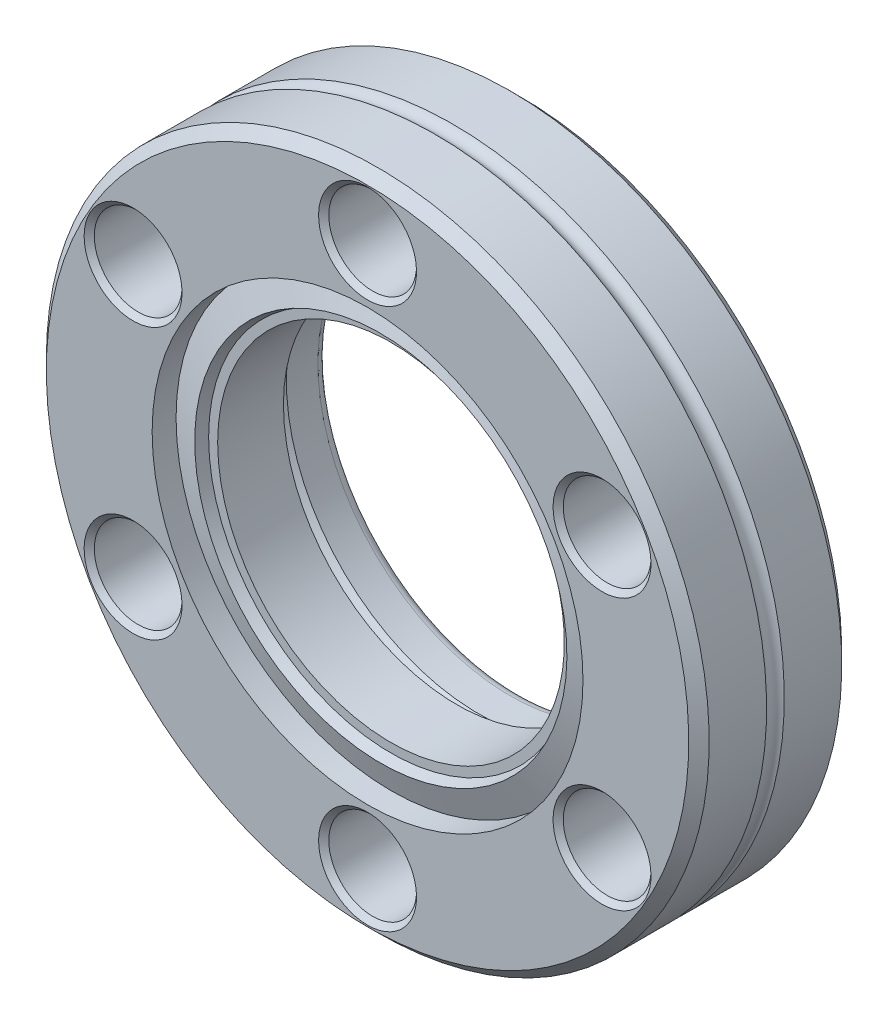
ISO-10303-21;
HEADER;
FILE_DESCRIPTION(('STEP AP214'),'2;1');
FILE_NAME('part.step','',(''),(''),'','','');
FILE_SCHEMA(('AUTOMOTIVE_DESIGN { 1 0 10303 214 1 1 1 1 }'));
ENDSEC;
DATA;
#1=APPLICATION_CONTEXT('core data for automotive mechanical design processes');
#2=APPLICATION_PROTOCOL_DEFINITION('international standard','automotive_design',2000,#1);
#3=PRODUCT_CONTEXT('',#1,'mechanical');
#4=PRODUCT('Part','Part','',(#3));
#5=PRODUCT_RELATED_PRODUCT_CATEGORY('part','',(#4));
#6=PRODUCT_DEFINITION_FORMATION('','',#4);
#7=PRODUCT_DEFINITION_CONTEXT('part definition',#1,'design');
#8=PRODUCT_DEFINITION('design','',#6,#7);
#9=PRODUCT_DEFINITION_SHAPE('','',#8);
#10=(LENGTH_UNIT() NAMED_UNIT(*) SI_UNIT(.MILLI.,.METRE.));
#11=(NAMED_UNIT(*) PLANE_ANGLE_UNIT() SI_UNIT($,.RADIAN.));
#12=(NAMED_UNIT(*) SI_UNIT($,.STERADIAN.) SOLID_ANGLE_UNIT());
#13=UNCERTAINTY_MEASURE_WITH_UNIT(LENGTH_MEASURE(1.E-05),#10,'distance_accuracy_value','');
#14=(GEOMETRIC_REPRESENTATION_CONTEXT(3) GLOBAL_UNCERTAINTY_ASSIGNED_CONTEXT((#13)) GLOBAL_UNIT_ASSIGNED_CONTEXT((#10,
#11,#12)) REPRESENTATION_CONTEXT('',''));
#15=CARTESIAN_POINT('',(0.,0.,0.));
#16=DIRECTION('',(0.,0.,1.));
#17=DIRECTION('',(1.,0.,0.));
#18=AXIS2_PLACEMENT_3D('',#15,#16,#17);
#19=CARTESIAN_POINT('',(0.,-13.4873999999881,3.81));
#20=DIRECTION('',(0.,0.,-1.));
#21=DIRECTION('',(0.866025403784439,0.5,0.));
#22=AXIS2_PLACEMENT_3D('',#19,#20,#21);
#23=CYLINDRICAL_SURFACE('',#22,2.1844);
#24=CARTESIAN_POINT('',(0.,-13.4873999999881,3.556));
#25=DIRECTION('',(0.,0.,-1.));
#26=DIRECTION('',(0.866025403784439,0.5,0.));
#27=AXIS2_PLACEMENT_3D('',#24,#25,#26);
#28=CIRCLE('',#27,2.1844);
#29=CARTESIAN_POINT('',(1.89174589202675,-12.3951999999881,3.556));
#30=VERTEX_POINT('',#29);
#31=EDGE_CURVE('E326',#30,#30,#28,.T.);
#32=ORIENTED_EDGE('',*,*,#31,.F.);
#33=EDGE_LOOP('',(#32));
#34=FACE_BOUND('',#33,.T.);
#35=CARTESIAN_POINT('',(0.,-13.4873999999881,-3.55600000006006));
#36=DIRECTION('',(0.,0.,-1.));
#37=DIRECTION('',(-0.866025403784439,-0.5,0.));
#38=AXIS2_PLACEMENT_3D('',#35,#36,#37);
#39=CIRCLE('',#38,2.18439999999742);
#40=CARTESIAN_POINT('',(-1.89174589202447,-14.5795999999868,-3.55600000006006));
#41=VERTEX_POINT('',#40);
#42=EDGE_CURVE('E275',#41,#41,#39,.T.);
#43=ORIENTED_EDGE('',*,*,#42,.T.);
#44=EDGE_LOOP('',(#43));
#45=FACE_BOUND('',#44,.T.);
#46=ADVANCED_FACE('F16',(#34,#45),#23,.F.);
#47=CARTESIAN_POINT('',(0.,0.,3.81));
#48=DIRECTION('',(0.,0.,-1.));
#49=DIRECTION('',(0.866025403784439,0.5,0.));
#50=AXIS2_PLACEMENT_3D('',#47,#48,#49);
#51=CYLINDRICAL_SURFACE('',#50,16.51);
#52=CARTESIAN_POINT('',(0.,0.,3.302));
#53=DIRECTION('',(0.,0.,-1.));
#54=DIRECTION('',(0.866025403784439,0.5,0.));
#55=AXIS2_PLACEMENT_3D('',#52,#53,#54);
#56=CIRCLE('',#55,16.51);
#57=CARTESIAN_POINT('',(14.2980794164811,8.255,3.302));
#58=VERTEX_POINT('',#57);
#59=EDGE_CURVE('E308',#58,#58,#56,.T.);
#60=ORIENTED_EDGE('',*,*,#59,.T.);
#61=EDGE_LOOP('',(#60));
#62=FACE_BOUND('',#61,.T.);
#63=CARTESIAN_POINT('',(0.,0.,0.439940905122494));
#64=DIRECTION('',(0.,0.,1.));
#65=DIRECTION('',(0.866025403784439,0.5,0.));
#66=AXIS2_PLACEMENT_3D('',#63,#64,#65);
#67=CIRCLE('',#66,16.51);
#68=CARTESIAN_POINT('',(14.2980794164811,8.255,0.439940905122494));
#69=VERTEX_POINT('',#68);
#70=EDGE_CURVE('E250',#69,#69,#67,.T.);
#71=ORIENTED_EDGE('',*,*,#70,.T.);
#72=EDGE_LOOP('',(#71));
#73=FACE_BOUND('',#72,.T.);
#74=ADVANCED_FACE('F362',(#62,#73),#51,.T.);
#75=CARTESIAN_POINT('',(0.,13.4873999999881,-3.80999999993037));
#76=DIRECTION('',(0.,0.,-1.));
#77=DIRECTION('',(-0.866025403784439,-0.5,0.));
#78=AXIS2_PLACEMENT_3D('',#75,#76,#77);
#79=CONICAL_SURFACE('',#78,2.43839999988173,0.785398163397448);
#80=CARTESIAN_POINT('',(0.,13.4873999999881,-3.55600000000322));
#81=DIRECTION('',(0.,0.,-1.));
#82=DIRECTION('',(-0.866025403784439,-0.5,0.));
#83=AXIS2_PLACEMENT_3D('',#80,#81,#82);
#84=CIRCLE('',#83,2.18440000001142);
#85=CARTESIAN_POINT('',(-1.89174589203663,12.3951999999823,-3.55600000000322));
#86=VERTEX_POINT('',#85);
#87=EDGE_CURVE('E234',#86,#86,#84,.T.);
#88=ORIENTED_EDGE('',*,*,#87,.F.);
#89=EDGE_LOOP('',(#88));
#90=FACE_BOUND('',#89,.T.);
#91=CARTESIAN_POINT('',(0.,13.4873999999881,-3.80999999998721));
#92=DIRECTION('',(0.,0.,1.));
#93=DIRECTION('',(-0.866025403784439,-0.5,0.));
#94=AXIS2_PLACEMENT_3D('',#91,#92,#93);
#95=CIRCLE('',#94,2.43839999993857);
#96=CARTESIAN_POINT('',(-2.11171634453479,12.2682000000188,-3.80999999998721));
#97=VERTEX_POINT('',#96);
#98=EDGE_CURVE('E286',#97,#97,#95,.T.);
#99=ORIENTED_EDGE('',*,*,#98,.F.);
#100=EDGE_LOOP('',(#99));
#101=FACE_BOUND('',#100,.T.);
#102=ADVANCED_FACE('F368',(#90,#101),#79,.F.);
#103=CARTESIAN_POINT('',(0.,0.,3.81));
#104=DIRECTION('',(0.,0.,-1.));
#105=DIRECTION('',(0.866025403784439,0.5,0.));
#106=AXIS2_PLACEMENT_3D('',#103,#104,#105);
#107=CYLINDRICAL_SURFACE('',#106,16.51);
#108=CARTESIAN_POINT('',(0.,0.,-0.439940905122491));
#109=DIRECTION('',(0.,0.,-1.));
#110=DIRECTION('',(0.866025403784439,0.5,0.));
#111=AXIS2_PLACEMENT_3D('',#108,#109,#110);
#112=CIRCLE('',#111,16.51);
#113=CARTESIAN_POINT('',(14.2980794164811,8.255,-0.439940905122491));
#114=VERTEX_POINT('',#113);
#115=EDGE_CURVE('E247',#114,#114,#112,.T.);
#116=ORIENTED_EDGE('',*,*,#115,.T.);
#117=EDGE_LOOP('',(#116));
#118=FACE_BOUND('',#117,.T.);
#119=CARTESIAN_POINT('',(0.,0.,-3.302));
#120=DIRECTION('',(0.,0.,-1.));
#121=DIRECTION('',(0.866025403784439,0.5,0.));
#122=AXIS2_PLACEMENT_3D('',#119,#120,#121);
#123=CIRCLE('',#122,16.51);
#124=CARTESIAN_POINT('',(14.2980794164811,8.255,-3.302));
#125=VERTEX_POINT('',#124);
#126=EDGE_CURVE('E24',#125,#125,#123,.T.);
#127=ORIENTED_EDGE('',*,*,#126,.F.);
#128=EDGE_LOOP('',(#127));
#129=FACE_BOUND('',#128,.T.);
#130=ADVANCED_FACE('F469',(#118,#129),#107,.T.);
#131=CARTESIAN_POINT('',(-11.6804310309919,6.74369999999402,3.81));
#132=DIRECTION('',(0.,0.,-1.));
#133=DIRECTION('',(0.866025403784439,0.5,0.));
#134=AXIS2_PLACEMENT_3D('',#131,#132,#133);
#135=CYLINDRICAL_SURFACE('',#134,2.1844);
#136=CARTESIAN_POINT('',(-11.6804310309919,6.74369999999402,3.556));
#137=DIRECTION('',(0.,0.,-1.));
#138=DIRECTION('',(0.866025403784439,0.5,0.));
#139=AXIS2_PLACEMENT_3D('',#136,#137,#138);
#140=CIRCLE('',#139,2.1844);
#141=CARTESIAN_POINT('',(-9.78868513896517,7.83589999999402,3.556));
#142=VERTEX_POINT('',#141);
#143=EDGE_CURVE('E237',#142,#142,#140,.T.);
#144=ORIENTED_EDGE('',*,*,#143,.F.);
#145=EDGE_LOOP('',(#144));
#146=FACE_BOUND('',#145,.T.);
#147=CARTESIAN_POINT('',(-11.6804310309919,6.74369999999402,-3.55600000006006));
#148=DIRECTION('',(0.,0.,-1.));
#149=DIRECTION('',(-0.866025403784439,-0.5,0.));
#150=AXIS2_PLACEMENT_3D('',#147,#148,#149);
#151=CIRCLE('',#150,2.18439999999742);
#152=CARTESIAN_POINT('',(-13.5721769230164,5.65149999999531,-3.55600000006006));
#153=VERTEX_POINT('',#152);
#154=EDGE_CURVE('E267',#153,#153,#151,.T.);
#155=ORIENTED_EDGE('',*,*,#154,.T.);
#156=EDGE_LOOP('',(#155));
#157=FACE_BOUND('',#156,.T.);
#158=ADVANCED_FACE('F510',(#146,#157),#135,.F.);
#159=CARTESIAN_POINT('',(0.,0.,2.6416));
#160=DIRECTION('',(0.,0.,-1.));
#161=DIRECTION('',(-1.,0.,0.));
#162=AXIS2_PLACEMENT_3D('',#159,#160,#161);
#163=PLANE('',#162);
#164=CARTESIAN_POINT('',(0.,0.,2.6416));
#165=DIRECTION('',(0.,0.,-1.));
#166=DIRECTION('',(-1.,0.,0.));
#167=AXIS2_PLACEMENT_3D('',#164,#165,#166);
#168=CIRCLE('',#167,8.636);
#169=CARTESIAN_POINT('',(-8.636,0.,2.6416));
#170=VERTEX_POINT('',#169);
#171=EDGE_CURVE('E11',#170,#170,#168,.T.);
#172=ORIENTED_EDGE('',*,*,#171,.T.);
#173=EDGE_LOOP('',(#172));
#174=FACE_BOUND('',#173,.T.);
#175=CARTESIAN_POINT('',(0.,0.,2.6416));
#176=DIRECTION('',(0.,0.,1.));
#177=DIRECTION('',(0.5,-0.866025403784439,0.));
#178=AXIS2_PLACEMENT_3D('',#175,#176,#177);
#179=CIRCLE('',#178,9.08610312099276);
#180=CARTESIAN_POINT('',(4.54305156049638,-7.86879612418481,2.6416));
#181=VERTEX_POINT('',#180);
#182=EDGE_CURVE('E270',#181,#181,#179,.T.);
#183=ORIENTED_EDGE('',*,*,#182,.T.);
#184=EDGE_LOOP('',(#183));
#185=FACE_BOUND('',#184,.T.);
#186=ADVANCED_FACE('F358',(#174,#185),#163,.F.);
#187=CARTESIAN_POINT('',(0.,0.,3.81000000004406));
#188=DIRECTION('',(0.,0.,1.));
#189=DIRECTION('',(-1.,0.,0.));
#190=AXIS2_PLACEMENT_3D('',#187,#188,#189);
#191=CYLINDRICAL_SURFACE('',#190,8.636);
#192=CARTESIAN_POINT('',(0.,0.,-0.635));
#193=DIRECTION('',(0.,0.,1.));
#194=DIRECTION('',(1.,0.,0.));
#195=AXIS2_PLACEMENT_3D('',#192,#193,#194);
#196=CIRCLE('',#195,8.636);
#197=CARTESIAN_POINT('',(8.636,0.,-0.635));
#198=VERTEX_POINT('',#197);
#199=EDGE_CURVE('E311',#198,#198,#196,.T.);
#200=ORIENTED_EDGE('',*,*,#199,.F.);
#201=EDGE_LOOP('',(#200));
#202=FACE_BOUND('',#201,.T.);
#203=ORIENTED_EDGE('',*,*,#171,.F.);
#204=EDGE_LOOP('',(#203));
#205=FACE_BOUND('',#204,.T.);
#206=ADVANCED_FACE('F347',(#202,#205),#191,.F.);
#207=CARTESIAN_POINT('',(0.,0.,-3.302));
#208=DIRECTION('',(0.,0.,1.));
#209=DIRECTION('',(0.5,-0.866025403784439,0.));
#210=AXIS2_PLACEMENT_3D('',#207,#208,#209);
#211=CONICAL_SURFACE('',#210,16.51,0.785398163397449);
#212=CARTESIAN_POINT('',(0.,0.,-3.81));
#213=DIRECTION('',(0.,0.,-1.));
#214=DIRECTION('',(0.5,-0.866025403784439,0.));
#215=AXIS2_PLACEMENT_3D('',#212,#213,#214);
#216=CIRCLE('',#215,16.002);
#217=CARTESIAN_POINT('',(8.001,-13.8581385113586,-3.81));
#218=VERTEX_POINT('',#217);
#219=EDGE_CURVE('E323',#218,#218,#216,.T.);
#220=ORIENTED_EDGE('',*,*,#219,.F.);
#221=EDGE_LOOP('',(#220));
#222=FACE_BOUND('',#221,.T.);
#223=ORIENTED_EDGE('',*,*,#126,.T.);
#224=EDGE_LOOP('',(#223));
#225=FACE_BOUND('',#224,.T.);
#226=ADVANCED_FACE('F345',(#222,#225),#211,.T.);
#227=CARTESIAN_POINT('',(0.,0.,-3.81));
#228=DIRECTION('',(0.,0.,-1.));
#229=DIRECTION('',(-1.,0.,0.));
#230=AXIS2_PLACEMENT_3D('',#227,#228,#229);
#231=PLANE('',#230);
#232=ORIENTED_EDGE('',*,*,#98,.T.);
#233=EDGE_LOOP('',(#232));
#234=FACE_BOUND('',#233,.T.);
#235=CARTESIAN_POINT('',(11.6804310309918,6.743699999994,-3.81000000004406));
#236=DIRECTION('',(0.,0.,1.));
#237=DIRECTION('',(-0.866025403784439,-0.5,0.));
#238=AXIS2_PLACEMENT_3D('',#235,#236,#237);
#239=CIRCLE('',#238,2.43839999997392);
#240=CARTESIAN_POINT('',(9.56871468642645,5.52450000000704,-3.81000000004406));
#241=VERTEX_POINT('',#240);
#242=EDGE_CURVE('E279',#241,#241,#239,.T.);
#243=ORIENTED_EDGE('',*,*,#242,.T.);
#244=EDGE_LOOP('',(#243));
#245=FACE_BOUND('',#244,.T.);
#246=CARTESIAN_POINT('',(11.6804310309919,-6.74369999999402,-3.80999999998721));
#247=DIRECTION('',(0.,0.,1.));
#248=DIRECTION('',(-0.866025403784439,-0.5,0.));
#249=AXIS2_PLACEMENT_3D('',#246,#247,#248);
#250=CIRCLE('',#249,2.43839999993856);
#251=CARTESIAN_POINT('',(9.56871468645713,-7.9628999999633,-3.80999999998721));
#252=VERTEX_POINT('',#251);
#253=EDGE_CURVE('E266',#252,#252,#250,.T.);
#254=ORIENTED_EDGE('',*,*,#253,.T.);
#255=EDGE_LOOP('',(#254));
#256=FACE_BOUND('',#255,.T.);
#257=CARTESIAN_POINT('',(0.,-13.4873999999881,-3.81000000004406));
#258=DIRECTION('',(0.,0.,1.));
#259=DIRECTION('',(-0.866025403784439,-0.5,0.));
#260=AXIS2_PLACEMENT_3D('',#257,#258,#259);
#261=CIRCLE('',#260,2.43840000003826);
#262=CARTESIAN_POINT('',(-2.11171634462108,-14.7066000000072,-3.81000000004406));
#263=VERTEX_POINT('',#262);
#264=EDGE_CURVE('E272',#263,#263,#261,.T.);
#265=ORIENTED_EDGE('',*,*,#264,.T.);
#266=EDGE_LOOP('',(#265));
#267=FACE_BOUND('',#266,.T.);
#268=CARTESIAN_POINT('',(-11.6804310309918,-6.74369999999401,-3.80999999998721));
#269=DIRECTION('',(0.,0.,1.));
#270=DIRECTION('',(-0.866025403784439,-0.5,0.));
#271=AXIS2_PLACEMENT_3D('',#268,#269,#270);
#272=CIRCLE('',#271,2.43839999994604);
#273=CARTESIAN_POINT('',(-13.7921473755331,-7.96289999996703,-3.80999999998721));
#274=VERTEX_POINT('',#273);
#275=EDGE_CURVE('E332',#274,#274,#272,.T.);
#276=ORIENTED_EDGE('',*,*,#275,.T.);
#277=EDGE_LOOP('',(#276));
#278=FACE_BOUND('',#277,.T.);
#279=CARTESIAN_POINT('',(-11.6804310309919,6.74369999999402,-3.81000000004406));
#280=DIRECTION('',(0.,0.,1.));
#281=DIRECTION('',(-0.866025403784439,-0.5,0.));
#282=AXIS2_PLACEMENT_3D('',#279,#280,#281);
#283=CIRCLE('',#282,2.43840000003825);
#284=CARTESIAN_POINT('',(-13.792147375613,5.52449999997489,-3.81000000004406));
#285=VERTEX_POINT('',#284);
#286=EDGE_CURVE('E271',#285,#285,#283,.T.);
#287=ORIENTED_EDGE('',*,*,#286,.T.);
#288=EDGE_LOOP('',(#287));
#289=FACE_BOUND('',#288,.T.);
#290=CARTESIAN_POINT('',(3.23460846031031E-06,-5.60250619583824E-06,-3.81));
#291=DIRECTION('',(0.,0.,1.));
#292=DIRECTION('',(-0.866025724153543,-0.499999445104023,0.));
#293=AXIS2_PLACEMENT_3D('',#290,#291,#292);
#294=CIRCLE('',#293,10.0965000000021);
#295=CARTESIAN_POINT('',(-8.74382548930958,-5.04825,-3.81));
#296=VERTEX_POINT('',#295);
#297=CARTESIAN_POINT('',(8.74382548930958,5.04825,-3.81));
#298=VERTEX_POINT('',#297);
#299=EDGE_CURVE('E213',#296,#298,#294,.T.);
#300=ORIENTED_EDGE('',*,*,#299,.T.);
#301=CARTESIAN_POINT('',(-3.23460871845885E-06,5.60250664296321E-06,-3.81));
#302=DIRECTION('',(0.,0.,1.));
#303=DIRECTION('',(0.866025724153569,0.499999445103979,0.));
#304=AXIS2_PLACEMENT_3D('',#301,#302,#303);
#305=CIRCLE('',#304,10.0965000000021);
#306=EDGE_CURVE('E220',#298,#296,#305,.T.);
#307=ORIENTED_EDGE('',*,*,#306,.T.);
#308=EDGE_LOOP('',(#300,#307));
#309=FACE_BOUND('',#308,.T.);
#310=ORIENTED_EDGE('',*,*,#219,.T.);
#311=EDGE_LOOP('',(#310));
#312=FACE_BOUND('',#311,.T.);
#313=ADVANCED_FACE('F343',(#234,#245,#256,#267,#278,#289,#309,#312),#231,.T.);
#314=CARTESIAN_POINT('',(0.,0.,3.1496));
#315=DIRECTION('',(0.,0.,1.));
#316=DIRECTION('',(0.5,-0.866025403784439,0.));
#317=AXIS2_PLACEMENT_3D('',#314,#315,#316);
#318=CONICAL_SURFACE('',#317,9.271,0.34906585039887);
#319=ORIENTED_EDGE('',*,*,#182,.F.);
#320=EDGE_LOOP('',(#319));
#321=FACE_BOUND('',#320,.T.);
#322=CARTESIAN_POINT('',(0.,0.,3.1496));
#323=DIRECTION('',(0.,0.,-1.));
#324=DIRECTION('',(-0.866025403784439,-0.5,0.));
#325=AXIS2_PLACEMENT_3D('',#322,#323,#324);
#326=CIRCLE('',#325,9.271);
#327=CARTESIAN_POINT('',(-8.02892151848552,-4.6355,3.1496));
#328=VERTEX_POINT('',#327);
#329=EDGE_CURVE('E317',#328,#328,#326,.T.);
#330=ORIENTED_EDGE('',*,*,#329,.F.);
#331=EDGE_LOOP('',(#330));
#332=FACE_BOUND('',#331,.T.);
#333=ADVANCED_FACE('F355',(#321,#332),#318,.F.);
#334=CARTESIAN_POINT('',(0.,0.,1.24216766505093));
#335=DIRECTION('',(0.,0.,1.));
#336=DIRECTION('',(-0.866025403784439,-0.5,0.));
#337=AXIS2_PLACEMENT_3D('',#334,#335,#336);
#338=CYLINDRICAL_SURFACE('',#337,10.7315);
#339=CARTESIAN_POINT('',(0.,0.,2.61802147285421));
#340=DIRECTION('',(0.,0.,1.));
#341=DIRECTION('',(-0.866025403784439,-0.5,0.));
#342=AXIS2_PLACEMENT_3D('',#339,#340,#341);
#343=CIRCLE('',#342,10.7315);
#344=CARTESIAN_POINT('',(-9.2937516207127,-5.36575,2.61802147285421));
#345=VERTEX_POINT('',#344);
#346=EDGE_CURVE('E314',#345,#345,#343,.T.);
#347=ORIENTED_EDGE('',*,*,#346,.F.);
#348=EDGE_LOOP('',(#347));
#349=FACE_BOUND('',#348,.T.);
#350=CARTESIAN_POINT('',(0.,0.,3.81));
#351=DIRECTION('',(0.,0.,1.));
#352=DIRECTION('',(-0.866025403784439,-0.5,0.));
#353=AXIS2_PLACEMENT_3D('',#350,#351,#352);
#354=CIRCLE('',#353,10.7315);
#355=CARTESIAN_POINT('',(-9.2937516207127,-5.36575,3.81));
#356=VERTEX_POINT('',#355);
#357=EDGE_CURVE('E292',#356,#356,#354,.T.);
#358=ORIENTED_EDGE('',*,*,#357,.T.);
#359=EDGE_LOOP('',(#358));
#360=FACE_BOUND('',#359,.T.);
#361=ADVANCED_FACE('F481',(#349,#360),#338,.F.);
#362=CARTESIAN_POINT('',(-11.6804310309919,6.74369999999402,-3.80999999993037));
#363=DIRECTION('',(0.,0.,-1.));
#364=DIRECTION('',(-0.866025403784439,-0.5,0.));
#365=AXIS2_PLACEMENT_3D('',#362,#363,#364);
#366=CONICAL_SURFACE('',#365,2.43839999992457,0.785398163397448);
#367=ORIENTED_EDGE('',*,*,#154,.F.);
#368=EDGE_LOOP('',(#367));
#369=FACE_BOUND('',#368,.T.);
#370=ORIENTED_EDGE('',*,*,#286,.F.);
#371=EDGE_LOOP('',(#370));
#372=FACE_BOUND('',#371,.T.);
#373=ADVANCED_FACE('F477',(#369,#372),#366,.F.);
#374=CARTESIAN_POINT('',(-11.6804310309918,-6.74369999999401,-3.80999999998721));
#375=DIRECTION('',(0.,0.,-1.));
#376=DIRECTION('',(-0.866025403784439,-0.5,0.));
#377=AXIS2_PLACEMENT_3D('',#374,#375,#376);
#378=CONICAL_SURFACE('',#377,2.43839999994604,0.785398163397448);
#379=CARTESIAN_POINT('',(-11.6804310309918,-6.74369999999401,-3.55600000000322));
#380=DIRECTION('',(0.,0.,-1.));
#381=DIRECTION('',(-0.866025403784439,-0.5,0.));
#382=AXIS2_PLACEMENT_3D('',#379,#380,#381);
#383=CIRCLE('',#382,2.18439999996205);
#384=CARTESIAN_POINT('',(-13.5721769229857,-7.83589999997504,-3.55600000000322));
#385=VERTEX_POINT('',#384);
#386=EDGE_CURVE('E329',#385,#385,#383,.T.);
#387=ORIENTED_EDGE('',*,*,#386,.F.);
#388=EDGE_LOOP('',(#387));
#389=FACE_BOUND('',#388,.T.);
#390=ORIENTED_EDGE('',*,*,#275,.F.);
#391=EDGE_LOOP('',(#390));
#392=FACE_BOUND('',#391,.T.);
#393=ADVANCED_FACE('F473',(#389,#392),#378,.F.);
#394=CARTESIAN_POINT('',(-11.6804310309918,-6.74369999999401,3.81));
#395=DIRECTION('',(0.,0.,-1.));
#396=DIRECTION('',(0.866025403784439,0.5,0.));
#397=AXIS2_PLACEMENT_3D('',#394,#395,#396);
#398=CYLINDRICAL_SURFACE('',#397,2.1844);
#399=CARTESIAN_POINT('',(-11.6804310309918,-6.74369999999401,3.556));
#400=DIRECTION('',(0.,0.,-1.));
#401=DIRECTION('',(0.866025403784439,0.5,0.));
#402=AXIS2_PLACEMENT_3D('',#399,#400,#401);
#403=CIRCLE('',#402,2.1844);
#404=CARTESIAN_POINT('',(-9.78868513896512,-5.65149999999401,3.556));
#405=VERTEX_POINT('',#404);
#406=EDGE_CURVE('E320',#405,#405,#403,.T.);
#407=ORIENTED_EDGE('',*,*,#406,.F.);
#408=EDGE_LOOP('',(#407));
#409=FACE_BOUND('',#408,.T.);
#410=ORIENTED_EDGE('',*,*,#386,.T.);
#411=EDGE_LOOP('',(#410));
#412=FACE_BOUND('',#411,.T.);
#413=ADVANCED_FACE('F465',(#409,#412),#398,.F.);
#414=CARTESIAN_POINT('',(0.,-13.4873999999881,3.80999999993037));
#415=DIRECTION('',(0.,0.,1.));
#416=DIRECTION('',(0.866025403784439,0.5,0.));
#417=AXIS2_PLACEMENT_3D('',#414,#415,#416);
#418=CONICAL_SURFACE('',#417,2.43839999993855,0.785398163397448);
#419=ORIENTED_EDGE('',*,*,#31,.T.);
#420=EDGE_LOOP('',(#419));
#421=FACE_BOUND('',#420,.T.);
#422=CARTESIAN_POINT('',(0.,-13.4873999999881,3.80999999998721));
#423=DIRECTION('',(0.,0.,-1.));
#424=DIRECTION('',(0.866025403784439,0.5,0.));
#425=AXIS2_PLACEMENT_3D('',#422,#423,#424);
#426=CIRCLE('',#425,2.43839999999539);
#427=CARTESIAN_POINT('',(2.11171634458401,-12.2681999999904,3.80999999998721));
#428=VERTEX_POINT('',#427);
#429=EDGE_CURVE('E246',#428,#428,#426,.T.);
#430=ORIENTED_EDGE('',*,*,#429,.F.);
#431=EDGE_LOOP('',(#430));
#432=FACE_BOUND('',#431,.T.);
#433=ADVANCED_FACE('F403',(#421,#432),#418,.F.);
#434=CARTESIAN_POINT('',(-11.6804310309918,-6.74369999999401,3.80999999998721));
#435=DIRECTION('',(0.,0.,1.));
#436=DIRECTION('',(0.866025403784439,0.5,0.));
#437=AXIS2_PLACEMENT_3D('',#434,#435,#436);
#438=CONICAL_SURFACE('',#437,2.43840000003077,0.785398163397448);
#439=ORIENTED_EDGE('',*,*,#406,.T.);
#440=EDGE_LOOP('',(#439));
#441=FACE_BOUND('',#440,.T.);
#442=CARTESIAN_POINT('',(-11.6804310309918,-6.74369999999401,3.80999999998721));
#443=DIRECTION('',(0.,0.,-1.));
#444=DIRECTION('',(0.866025403784439,0.5,0.));
#445=AXIS2_PLACEMENT_3D('',#442,#443,#444);
#446=CIRCLE('',#445,2.43840000003077);
#447=CARTESIAN_POINT('',(-9.56871468637722,-5.52449999997862,3.80999999998721));
#448=VERTEX_POINT('',#447);
#449=EDGE_CURVE('E295',#448,#448,#446,.T.);
#450=ORIENTED_EDGE('',*,*,#449,.F.);
#451=EDGE_LOOP('',(#450));
#452=FACE_BOUND('',#451,.T.);
#453=ADVANCED_FACE('F400',(#441,#452),#438,.F.);
#454=CARTESIAN_POINT('',(0.,0.,2.61802147285421));
#455=DIRECTION('',(0.,0.,-1.));
#456=DIRECTION('',(-0.5,0.866025403784439,0.));
#457=AXIS2_PLACEMENT_3D('',#454,#455,#456);
#458=CONICAL_SURFACE('',#457,10.7315,1.22173047639603);
#459=ORIENTED_EDGE('',*,*,#329,.T.);
#460=EDGE_LOOP('',(#459));
#461=FACE_BOUND('',#460,.T.);
#462=ORIENTED_EDGE('',*,*,#346,.T.);
#463=EDGE_LOOP('',(#462));
#464=FACE_BOUND('',#463,.T.);
#465=ADVANCED_FACE('F402',(#461,#464),#458,.T.);
#466=CARTESIAN_POINT('',(0.,0.,-0.635));
#467=DIRECTION('',(0.,0.,1.));
#468=DIRECTION('',(0.,-1.,0.));
#469=AXIS2_PLACEMENT_3D('',#466,#467,#468);
#470=PLANE('',#469);
#471=ORIENTED_EDGE('',*,*,#199,.T.);
#472=EDGE_LOOP('',(#471));
#473=FACE_BOUND('',#472,.T.);
#474=CARTESIAN_POINT('',(4.78911990565902E-06,-8.29499899009708E-06,-0.635));
#475=DIRECTION('',(0.,0.,-1.));
#476=DIRECTION('',(0.866024904319033,0.500000865098462,0.));
#477=AXIS2_PLACEMENT_3D('',#474,#475,#476);
#478=CIRCLE('',#477,9.58850000000478);
#479=CARTESIAN_POINT('',(8.30388458418709,4.79425,-0.635));
#480=VERTEX_POINT('',#479);
#481=CARTESIAN_POINT('',(-8.30388458418708,-4.79425,-0.635));
#482=VERTEX_POINT('',#481);
#483=EDGE_CURVE('E258',#480,#482,#478,.T.);
#484=ORIENTED_EDGE('',*,*,#483,.T.);
#485=CARTESIAN_POINT('',(-1.20719979295088E-05,2.09093137710798E-05,-0.635));
#486=DIRECTION('',(0.,0.,-1.));
#487=DIRECTION('',(-0.866024144773721,-0.500002180664189,0.));
#488=AXIS2_PLACEMENT_3D('',#485,#486,#487);
#489=CIRCLE('',#488,9.5885000000304);
#490=EDGE_CURVE('E255',#482,#480,#489,.T.);
#491=ORIENTED_EDGE('',*,*,#490,.T.);
#492=EDGE_LOOP('',(#484,#491));
#493=FACE_BOUND('',#492,.T.);
#494=ADVANCED_FACE('F455',(#473,#493),#470,.F.);
#495=CARTESIAN_POINT('',(0.,0.,3.302));
#496=DIRECTION('',(0.,0.,-1.));
#497=DIRECTION('',(-0.5,0.866025403784439,0.));
#498=AXIS2_PLACEMENT_3D('',#495,#496,#497);
#499=CONICAL_SURFACE('',#498,16.51,0.78539816339745);
#500=CARTESIAN_POINT('',(0.,0.,3.81));
#501=DIRECTION('',(0.,0.,-1.));
#502=DIRECTION('',(-0.5,0.866025403784439,0.));
#503=AXIS2_PLACEMENT_3D('',#500,#501,#502);
#504=CIRCLE('',#503,16.002);
#505=CARTESIAN_POINT('',(-8.001,13.8581385113586,3.81));
#506=VERTEX_POINT('',#505);
#507=EDGE_CURVE('E289',#506,#506,#504,.T.);
#508=ORIENTED_EDGE('',*,*,#507,.T.);
#509=EDGE_LOOP('',(#508));
#510=FACE_BOUND('',#509,.T.);
#511=ORIENTED_EDGE('',*,*,#59,.F.);
#512=EDGE_LOOP('',(#511));
#513=FACE_BOUND('',#512,.T.);
#514=ADVANCED_FACE('F448',(#510,#513),#499,.T.);
#515=CARTESIAN_POINT('',(11.6804310309919,-6.74369999999402,3.80999999998721));
#516=DIRECTION('',(0.,0.,1.));
#517=DIRECTION('',(0.866025403784439,0.5,0.));
#518=AXIS2_PLACEMENT_3D('',#515,#516,#517);
#519=CONICAL_SURFACE('',#518,2.4383999999814,0.785398163397448);
#520=CARTESIAN_POINT('',(11.6804310309919,-6.74369999999402,3.556));
#521=DIRECTION('',(0.,0.,-1.));
#522=DIRECTION('',(0.866025403784439,0.5,0.));
#523=AXIS2_PLACEMENT_3D('',#520,#521,#522);
#524=CIRCLE('',#523,2.1844);
#525=CARTESIAN_POINT('',(13.5721769230186,-5.65149999999402,3.556));
#526=VERTEX_POINT('',#525);
#527=EDGE_CURVE('E254',#526,#526,#524,.T.);
#528=ORIENTED_EDGE('',*,*,#527,.T.);
#529=EDGE_LOOP('',(#528));
#530=FACE_BOUND('',#529,.T.);
#531=CARTESIAN_POINT('',(11.6804310309919,-6.74369999999402,3.80999999998721));
#532=DIRECTION('',(0.,0.,-1.));
#533=DIRECTION('',(0.866025403784439,0.5,0.));
#534=AXIS2_PLACEMENT_3D('',#531,#532,#533);
#535=CIRCLE('',#534,2.4383999999814);
#536=CARTESIAN_POINT('',(13.7921473755638,-5.52450000000332,3.80999999998721));
#537=VERTEX_POINT('',#536);
#538=EDGE_CURVE('E242',#537,#537,#535,.T.);
#539=ORIENTED_EDGE('',*,*,#538,.F.);
#540=EDGE_LOOP('',(#539));
#541=FACE_BOUND('',#540,.T.);
#542=ADVANCED_FACE('F441',(#530,#541),#519,.F.);
#543=CARTESIAN_POINT('',(0.,13.4873999999881,3.80999999998721));
#544=DIRECTION('',(0.,0.,1.));
#545=DIRECTION('',(0.866025403784439,0.5,0.));
#546=AXIS2_PLACEMENT_3D('',#543,#544,#545);
#547=CONICAL_SURFACE('',#546,2.43839999998139,0.785398163397448);
#548=CARTESIAN_POINT('',(0.,13.4873999999881,3.556));
#549=DIRECTION('',(0.,0.,-1.));
#550=DIRECTION('',(0.866025403784439,0.5,0.));
#551=AXIS2_PLACEMENT_3D('',#548,#549,#550);
#552=CIRCLE('',#551,2.1844);
#553=CARTESIAN_POINT('',(1.89174589202672,14.5795999999881,3.556));
#554=VERTEX_POINT('',#553);
#555=EDGE_CURVE('E223',#554,#554,#552,.T.);
#556=ORIENTED_EDGE('',*,*,#555,.T.);
#557=EDGE_LOOP('',(#556));
#558=FACE_BOUND('',#557,.T.);
#559=CARTESIAN_POINT('',(0.,13.4873999999881,3.80999999998721));
#560=DIRECTION('',(0.,0.,-1.));
#561=DIRECTION('',(0.866025403784439,0.5,0.));
#562=AXIS2_PLACEMENT_3D('',#559,#560,#561);
#563=CIRCLE('',#562,2.43839999998139);
#564=CARTESIAN_POINT('',(2.11171634457185,14.7065999999788,3.80999999998721));
#565=VERTEX_POINT('',#564);
#566=EDGE_CURVE('E302',#565,#565,#563,.T.);
#567=ORIENTED_EDGE('',*,*,#566,.F.);
#568=EDGE_LOOP('',(#567));
#569=FACE_BOUND('',#568,.T.);
#570=ADVANCED_FACE('F437',(#558,#569),#547,.F.);
#571=CARTESIAN_POINT('',(11.6804310309918,6.743699999994,3.80999999998721));
#572=DIRECTION('',(0.,0.,1.));
#573=DIRECTION('',(0.866025403784439,0.5,0.));
#574=AXIS2_PLACEMENT_3D('',#571,#572,#573);
#575=CONICAL_SURFACE('',#574,2.43840000005973,0.785398163509344);
#576=CARTESIAN_POINT('',(11.6804310309918,6.743699999994,3.556));
#577=DIRECTION('',(0.,0.,-1.));
#578=DIRECTION('',(0.866025403784439,0.5,0.));
#579=AXIS2_PLACEMENT_3D('',#576,#577,#578);
#580=CIRCLE('',#579,2.1844);
#581=CARTESIAN_POINT('',(13.5721769230186,7.835899999994,3.556));
#582=VERTEX_POINT('',#581);
#583=EDGE_CURVE('E305',#582,#582,#580,.T.);
#584=ORIENTED_EDGE('',*,*,#583,.T.);
#585=EDGE_LOOP('',(#584));
#586=FACE_BOUND('',#585,.T.);
#587=CARTESIAN_POINT('',(11.6804310309918,6.743699999994,3.80999999998721));
#588=DIRECTION('',(0.,0.,-1.));
#589=DIRECTION('',(0.866025403784439,0.5,0.));
#590=AXIS2_PLACEMENT_3D('',#587,#588,#589);
#591=CIRCLE('',#590,2.43840000005973);
#592=CARTESIAN_POINT('',(13.7921473756315,7.96290000002386,3.80999999998721));
#593=VERTEX_POINT('',#592);
#594=EDGE_CURVE('E245',#593,#593,#591,.T.);
#595=ORIENTED_EDGE('',*,*,#594,.F.);
#596=EDGE_LOOP('',(#595));
#597=FACE_BOUND('',#596,.T.);
#598=ADVANCED_FACE('F440',(#586,#597),#575,.F.);
#599=CARTESIAN_POINT('',(11.6804310309918,6.743699999994,3.81));
#600=DIRECTION('',(0.,0.,-1.));
#601=DIRECTION('',(0.866025403784439,0.5,0.));
#602=AXIS2_PLACEMENT_3D('',#599,#600,#601);
#603=CYLINDRICAL_SURFACE('',#602,2.1844);
#604=ORIENTED_EDGE('',*,*,#583,.F.);
#605=EDGE_LOOP('',(#604));
#606=FACE_BOUND('',#605,.T.);
#607=CARTESIAN_POINT('',(11.6804310309918,6.743699999994,-3.55599999994638));
#608=DIRECTION('',(0.,0.,-1.));
#609=DIRECTION('',(-0.866025403784439,-0.5,0.));
#610=AXIS2_PLACEMENT_3D('',#607,#608,#609);
#611=CIRCLE('',#610,2.18439999993309);
#612=CARTESIAN_POINT('',(9.78868513902306,5.65150000002745,-3.55599999994638));
#613=VERTEX_POINT('',#612);
#614=EDGE_CURVE('E276',#613,#613,#611,.T.);
#615=ORIENTED_EDGE('',*,*,#614,.T.);
#616=EDGE_LOOP('',(#615));
#617=FACE_BOUND('',#616,.T.);
#618=ADVANCED_FACE('F408',(#606,#617),#603,.F.);
#619=CARTESIAN_POINT('',(0.,0.,3.81));
#620=DIRECTION('',(0.,0.,-1.));
#621=DIRECTION('',(-1.,0.,0.));
#622=AXIS2_PLACEMENT_3D('',#619,#620,#621);
#623=PLANE('',#622);
#624=ORIENTED_EDGE('',*,*,#566,.T.);
#625=EDGE_LOOP('',(#624));
#626=FACE_BOUND('',#625,.T.);
#627=ORIENTED_EDGE('',*,*,#594,.T.);
#628=EDGE_LOOP('',(#627));
#629=FACE_BOUND('',#628,.T.);
#630=ORIENTED_EDGE('',*,*,#538,.T.);
#631=EDGE_LOOP('',(#630));
#632=FACE_BOUND('',#631,.T.);
#633=ORIENTED_EDGE('',*,*,#429,.T.);
#634=EDGE_LOOP('',(#633));
#635=FACE_BOUND('',#634,.T.);
#636=ORIENTED_EDGE('',*,*,#449,.T.);
#637=EDGE_LOOP('',(#636));
#638=FACE_BOUND('',#637,.T.);
#639=CARTESIAN_POINT('',(-11.6804310309919,6.74369999999402,3.81000000004406));
#640=DIRECTION('',(0.,0.,-1.));
#641=DIRECTION('',(0.5,-0.866025403784439,0.));
#642=AXIS2_PLACEMENT_3D('',#639,#640,#641);
#643=CIRCLE('',#642,2.43839999999539);
#644=CARTESIAN_POINT('',(-10.4612310309942,4.63198365541003,3.81000000004406));
#645=VERTEX_POINT('',#644);
#646=EDGE_CURVE('E233',#645,#645,#643,.T.);
#647=ORIENTED_EDGE('',*,*,#646,.T.);
#648=EDGE_LOOP('',(#647));
#649=FACE_BOUND('',#648,.T.);
#650=ORIENTED_EDGE('',*,*,#357,.F.);
#651=EDGE_LOOP('',(#650));
#652=FACE_BOUND('',#651,.T.);
#653=ORIENTED_EDGE('',*,*,#507,.F.);
#654=EDGE_LOOP('',(#653));
#655=FACE_BOUND('',#654,.T.);
#656=ADVANCED_FACE('F378',(#626,#629,#632,#635,#638,#649,#652,#655),#623,.F.);
#657=CARTESIAN_POINT('',(0.,-13.4873999999881,-3.80999999993037));
#658=DIRECTION('',(0.,0.,-1.));
#659=DIRECTION('',(-0.866025403784439,-0.5,0.));
#660=AXIS2_PLACEMENT_3D('',#657,#658,#659);
#661=CONICAL_SURFACE('',#660,2.43839999992457,0.785398163397448);
#662=ORIENTED_EDGE('',*,*,#42,.F.);
#663=EDGE_LOOP('',(#662));
#664=FACE_BOUND('',#663,.T.);
#665=ORIENTED_EDGE('',*,*,#264,.F.);
#666=EDGE_LOOP('',(#665));
#667=FACE_BOUND('',#666,.T.);
#668=ADVANCED_FACE('F374',(#664,#667),#661,.F.);
#669=CARTESIAN_POINT('',(11.6804310309918,6.743699999994,-3.80999999998721));
#670=DIRECTION('',(0.,0.,-1.));
#671=DIRECTION('',(-0.866025403784439,-0.5,0.));
#672=AXIS2_PLACEMENT_3D('',#669,#670,#671);
#673=CONICAL_SURFACE('',#672,2.43839999991708,0.785398163285552);
#674=ORIENTED_EDGE('',*,*,#614,.F.);
#675=EDGE_LOOP('',(#674));
#676=FACE_BOUND('',#675,.T.);
#677=ORIENTED_EDGE('',*,*,#242,.F.);
#678=EDGE_LOOP('',(#677));
#679=FACE_BOUND('',#678,.T.);
#680=ADVANCED_FACE('F377',(#676,#679),#673,.F.);
#681=CARTESIAN_POINT('',(11.6804310309919,-6.74369999999402,-3.80999999993037));
#682=DIRECTION('',(0.,0.,-1.));
#683=DIRECTION('',(-0.866025403784439,-0.5,0.));
#684=AXIS2_PLACEMENT_3D('',#681,#682,#683);
#685=CONICAL_SURFACE('',#684,2.43839999988172,0.785398163397448);
#686=CARTESIAN_POINT('',(11.6804310309919,-6.74369999999402,-3.55600000000322));
#687=DIRECTION('',(0.,0.,-1.));
#688=DIRECTION('',(-0.866025403784439,-0.5,0.));
#689=AXIS2_PLACEMENT_3D('',#686,#687,#688);
#690=CIRCLE('',#689,2.18440000001141);
#691=CARTESIAN_POINT('',(9.78868513895529,-7.83589999999973,-3.55600000000322));
#692=VERTEX_POINT('',#691);
#693=EDGE_CURVE('E251',#692,#692,#690,.T.);
#694=ORIENTED_EDGE('',*,*,#693,.F.);
#695=EDGE_LOOP('',(#694));
#696=FACE_BOUND('',#695,.T.);
#697=ORIENTED_EDGE('',*,*,#253,.F.);
#698=EDGE_LOOP('',(#697));
#699=FACE_BOUND('',#698,.T.);
#700=ADVANCED_FACE('F414',(#696,#699),#685,.F.);
#701=CARTESIAN_POINT('',(11.6804310309919,-6.74369999999402,3.81));
#702=DIRECTION('',(0.,0.,-1.));
#703=DIRECTION('',(0.866025403784439,0.5,0.));
#704=AXIS2_PLACEMENT_3D('',#701,#702,#703);
#705=CYLINDRICAL_SURFACE('',#704,2.1844);
#706=ORIENTED_EDGE('',*,*,#527,.F.);
#707=EDGE_LOOP('',(#706));
#708=FACE_BOUND('',#707,.T.);
#709=ORIENTED_EDGE('',*,*,#693,.T.);
#710=EDGE_LOOP('',(#709));
#711=FACE_BOUND('',#710,.T.);
#712=ADVANCED_FACE('F417',(#708,#711),#705,.F.);
#713=CARTESIAN_POINT('',(0.,0.,-1.016));
#714=DIRECTION('',(0.,0.,1.));
#715=DIRECTION('',(0.,-1.,0.));
#716=AXIS2_PLACEMENT_3D('',#713,#714,#715);
#717=TOROIDAL_SURFACE('',#716,9.5885,0.380999999999995);
#718=CARTESIAN_POINT('',(0.,-9.9695,-1.016));
#719=VERTEX_POINT('',#718);
#720=VERTEX_LOOP('',#719);
#721=FACE_BOUND('',#720,.T.);
#722=CARTESIAN_POINT('',(0.,0.,-1.21789923967284));
#723=DIRECTION('',(0.,0.,-1.));
#724=DIRECTION('',(0.866025403784439,0.5,0.));
#725=AXIS2_PLACEMENT_3D('',#722,#723,#724);
#726=CIRCLE('',#725,9.91160632463557);
#727=CARTESIAN_POINT('',(8.58370286944492,4.95580316231779,-1.21789923967284));
#728=VERTEX_POINT('',#727);
#729=EDGE_CURVE('E230',#728,#728,#726,.T.);
#730=ORIENTED_EDGE('',*,*,#729,.T.);
#731=EDGE_LOOP('',(#730));
#732=FACE_BOUND('',#731,.T.);
#733=ORIENTED_EDGE('',*,*,#483,.F.);
#734=ORIENTED_EDGE('',*,*,#490,.F.);
#735=EDGE_LOOP('',(#733,#734));
#736=FACE_BOUND('',#735,.T.);
#737=ADVANCED_FACE('F426',(#721,#732,#736),#717,.F.);
#738=CARTESIAN_POINT('',(0.,0.,0.));
#739=DIRECTION('',(0.,0.,1.));
#740=DIRECTION('',(0.,-1.,0.));
#741=AXIS2_PLACEMENT_3D('',#738,#739,#740);
#742=TOROIDAL_SURFACE('',#741,16.764,0.508000000000007);
#743=ORIENTED_EDGE('',*,*,#70,.F.);
#744=EDGE_LOOP('',(#743));
#745=FACE_BOUND('',#744,.T.);
#746=ORIENTED_EDGE('',*,*,#115,.F.);
#747=EDGE_LOOP('',(#746));
#748=FACE_BOUND('',#747,.T.);
#749=ADVANCED_FACE('F423',(#745,#748),#742,.F.);
#750=CARTESIAN_POINT('',(0.,13.4873999999881,3.81));
#751=DIRECTION('',(0.,0.,-1.));
#752=DIRECTION('',(0.866025403784439,0.5,0.));
#753=AXIS2_PLACEMENT_3D('',#750,#751,#752);
#754=CYLINDRICAL_SURFACE('',#753,2.1844);
#755=ORIENTED_EDGE('',*,*,#555,.F.);
#756=EDGE_LOOP('',(#755));
#757=FACE_BOUND('',#756,.T.);
#758=ORIENTED_EDGE('',*,*,#87,.T.);
#759=EDGE_LOOP('',(#758));
#760=FACE_BOUND('',#759,.T.);
#761=ADVANCED_FACE('F421',(#757,#760),#754,.F.);
#762=CARTESIAN_POINT('',(-11.6804310309919,6.74369999999402,3.81000000004406));
#763=DIRECTION('',(0.,0.,1.));
#764=DIRECTION('',(0.5,-0.866025403784439,0.));
#765=AXIS2_PLACEMENT_3D('',#762,#763,#764);
#766=CONICAL_SURFACE('',#765,2.43839999999539,0.785398163397448);
#767=ORIENTED_EDGE('',*,*,#143,.T.);
#768=EDGE_LOOP('',(#767));
#769=FACE_BOUND('',#768,.T.);
#770=ORIENTED_EDGE('',*,*,#646,.F.);
#771=EDGE_LOOP('',(#770));
#772=FACE_BOUND('',#771,.T.);
#773=ADVANCED_FACE('F412',(#769,#772),#766,.F.);
#774=CARTESIAN_POINT('',(0.,0.,-1.21789923967284));
#775=DIRECTION('',(0.,0.,1.));
#776=DIRECTION('',(0.5,-0.866025403784439,0.));
#777=AXIS2_PLACEMENT_3D('',#774,#775,#776);
#778=CONICAL_SURFACE('',#777,9.91160632463557,0.55850536063815);
#779=CARTESIAN_POINT('',(0.,0.,-1.73497744753876));
#780=DIRECTION('',(0.,0.,-1.));
#781=DIRECTION('',(-0.866025403784439,-0.5,0.));
#782=AXIS2_PLACEMENT_3D('',#779,#780,#781);
#783=CIRCLE('',#782,9.5885);
#784=CARTESIAN_POINT('',(-8.30388458418708,-4.79425,-1.73497744753876));
#785=VERTEX_POINT('',#784);
#786=EDGE_CURVE('E227',#785,#785,#783,.T.);
#787=ORIENTED_EDGE('',*,*,#786,.T.);
#788=EDGE_LOOP('',(#787));
#789=FACE_BOUND('',#788,.T.);
#790=ORIENTED_EDGE('',*,*,#729,.F.);
#791=EDGE_LOOP('',(#790));
#792=FACE_BOUND('',#791,.T.);
#793=ADVANCED_FACE('F396',(#789,#792),#778,.F.);
#794=CARTESIAN_POINT('',(0.,0.,-3.81));
#795=DIRECTION('',(0.,0.,1.));
#796=DIRECTION('',(-0.866025403784439,-0.5,0.));
#797=AXIS2_PLACEMENT_3D('',#794,#795,#796);
#798=CYLINDRICAL_SURFACE('',#797,9.5885);
#799=CARTESIAN_POINT('',(0.,0.,-3.302));
#800=DIRECTION('',(0.,0.,1.));
#801=DIRECTION('',(-0.866025403784439,-0.5,0.));
#802=AXIS2_PLACEMENT_3D('',#799,#800,#801);
#803=CIRCLE('',#802,9.5885);
#804=CARTESIAN_POINT('',(-8.30388458418708,-4.79425,-3.302));
#805=VERTEX_POINT('',#804);
#806=EDGE_CURVE('E209',#805,#805,#803,.T.);
#807=ORIENTED_EDGE('',*,*,#806,.F.);
#808=EDGE_LOOP('',(#807));
#809=FACE_BOUND('',#808,.T.);
#810=ORIENTED_EDGE('',*,*,#786,.F.);
#811=EDGE_LOOP('',(#810));
#812=FACE_BOUND('',#811,.T.);
#813=ADVANCED_FACE('F390',(#809,#812),#798,.F.);
#814=CARTESIAN_POINT('',(0.,0.,-3.302));
#815=DIRECTION('',(0.,0.,-1.));
#816=DIRECTION('',(0.,1.,0.));
#817=AXIS2_PLACEMENT_3D('',#814,#815,#816);
#818=TOROIDAL_SURFACE('',#817,10.0965,0.508000000000006);
#819=ORIENTED_EDGE('',*,*,#299,.F.);
#820=ORIENTED_EDGE('',*,*,#306,.F.);
#821=EDGE_LOOP('',(#819,#820));
#822=FACE_BOUND('',#821,.T.);
#823=ORIENTED_EDGE('',*,*,#806,.T.);
#824=EDGE_LOOP('',(#823));
#825=FACE_BOUND('',#824,.T.);
#826=ADVANCED_FACE('F210',(#822,#825),#818,.T.);
#827=CLOSED_SHELL('',(#46,#74,#102,#130,#158,#186,#206,#226,#313,#333,#361,#373,#393,#413,#433,
#453,#465,#494,#514,#542,#570,#598,#618,#656,#668,#680,#700,#712,#737,#749,#761,#773,#793,#813,#826));
#828=MANIFOLD_SOLID_BREP('B1',#827);
#829=ADVANCED_BREP_SHAPE_REPRESENTATION('',(#18,#828),#14);
#830=SHAPE_DEFINITION_REPRESENTATION(#9,#829);
ENDSEC;
END-ISO-10303-21;
